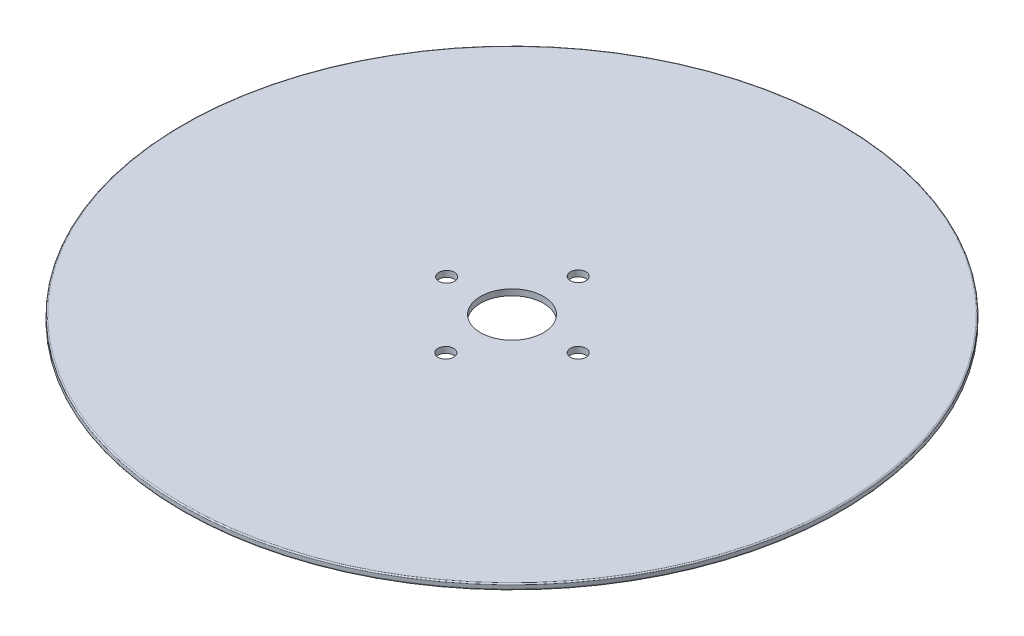
ISO-10303-21;
HEADER;
FILE_DESCRIPTION(('STEP AP214'),'2;1');
FILE_NAME('part.step','',(''),(''),'','','');
FILE_SCHEMA(('AUTOMOTIVE_DESIGN { 1 0 10303 214 1 1 1 1 }'));
ENDSEC;
DATA;
#1=APPLICATION_CONTEXT('core data for automotive mechanical design processes');
#2=APPLICATION_PROTOCOL_DEFINITION('international standard','automotive_design',2000,#1);
#3=PRODUCT_CONTEXT('',#1,'mechanical');
#4=PRODUCT('Part','Part','',(#3));
#5=PRODUCT_RELATED_PRODUCT_CATEGORY('part','',(#4));
#6=PRODUCT_DEFINITION_FORMATION('','',#4);
#7=PRODUCT_DEFINITION_CONTEXT('part definition',#1,'design');
#8=PRODUCT_DEFINITION('design','',#6,#7);
#9=PRODUCT_DEFINITION_SHAPE('','',#8);
#10=(LENGTH_UNIT() NAMED_UNIT(*) SI_UNIT(.MILLI.,.METRE.));
#11=(NAMED_UNIT(*) PLANE_ANGLE_UNIT() SI_UNIT($,.RADIAN.));
#12=(NAMED_UNIT(*) SI_UNIT($,.STERADIAN.) SOLID_ANGLE_UNIT());
#13=UNCERTAINTY_MEASURE_WITH_UNIT(LENGTH_MEASURE(1.E-05),#10,'distance_accuracy_value','');
#14=(GEOMETRIC_REPRESENTATION_CONTEXT(3) GLOBAL_UNCERTAINTY_ASSIGNED_CONTEXT((#13)) GLOBAL_UNIT_ASSIGNED_CONTEXT((#10,
#11,#12)) REPRESENTATION_CONTEXT('',''));
#15=CARTESIAN_POINT('',(0.,0.,0.));
#16=DIRECTION('',(0.,0.,1.));
#17=DIRECTION('',(1.,0.,0.));
#18=AXIS2_PLACEMENT_3D('',#15,#16,#17);
#19=CARTESIAN_POINT('',(0.,1.,0.));
#20=DIRECTION('',(0.,-1.,0.));
#21=DIRECTION('',(0.,0.,-1.));
#22=AXIS2_PLACEMENT_3D('',#19,#20,#21);
#23=CYLINDRICAL_SURFACE('',#22,55.);
#24=CARTESIAN_POINT('',(0.,0.8,0.));
#25=DIRECTION('',(0.,1.,0.));
#26=DIRECTION('',(0.,0.,1.));
#27=AXIS2_PLACEMENT_3D('',#24,#25,#26);
#28=CIRCLE('',#27,55.);
#29=CARTESIAN_POINT('',(0.,0.8,55.));
#30=VERTEX_POINT('',#29);
#31=EDGE_CURVE('E44',#30,#30,#28,.F.);
#32=ORIENTED_EDGE('',*,*,#31,.T.);
#33=EDGE_LOOP('',(#32));
#34=FACE_BOUND('',#33,.T.);
#35=CARTESIAN_POINT('',(0.,0.2,0.));
#36=DIRECTION('',(0.,1.,0.));
#37=DIRECTION('',(0.,0.,1.));
#38=AXIS2_PLACEMENT_3D('',#35,#36,#37);
#39=CIRCLE('',#38,55.);
#40=CARTESIAN_POINT('',(0.,0.2,55.));
#41=VERTEX_POINT('',#40);
#42=EDGE_CURVE('E49',#41,#41,#39,.T.);
#43=ORIENTED_EDGE('',*,*,#42,.T.);
#44=EDGE_LOOP('',(#43));
#45=FACE_BOUND('',#44,.T.);
#46=ADVANCED_FACE('F36',(#34,#45),#23,.T.);
#47=CARTESIAN_POINT('',(0.,1.,0.));
#48=DIRECTION('',(0.,1.,0.));
#49=DIRECTION('',(0.,0.,1.));
#50=AXIS2_PLACEMENT_3D('',#47,#48,#49);
#51=PLANE('',#50);
#52=CARTESIAN_POINT('',(-10.9009167309934,1.,0.));
#53=DIRECTION('',(0.,1.,0.));
#54=DIRECTION('',(0.,0.,1.));
#55=AXIS2_PLACEMENT_3D('',#52,#53,#54);
#56=CIRCLE('',#55,1.3);
#57=CARTESIAN_POINT('',(-10.9009167309934,1.,1.3));
#58=VERTEX_POINT('',#57);
#59=EDGE_CURVE('E90',#58,#58,#56,.T.);
#60=ORIENTED_EDGE('',*,*,#59,.F.);
#61=EDGE_LOOP('',(#60));
#62=FACE_BOUND('',#61,.T.);
#63=CARTESIAN_POINT('',(0.,1.,-11.05));
#64=DIRECTION('',(0.,1.,0.));
#65=DIRECTION('',(0.,0.,1.));
#66=AXIS2_PLACEMENT_3D('',#63,#64,#65);
#67=CIRCLE('',#66,1.3);
#68=CARTESIAN_POINT('',(0.,1.,-9.75));
#69=VERTEX_POINT('',#68);
#70=EDGE_CURVE('E82',#69,#69,#67,.T.);
#71=ORIENTED_EDGE('',*,*,#70,.F.);
#72=EDGE_LOOP('',(#71));
#73=FACE_BOUND('',#72,.T.);
#74=CARTESIAN_POINT('',(11.05,1.,0.));
#75=DIRECTION('',(0.,1.,0.));
#76=DIRECTION('',(0.,0.,1.));
#77=AXIS2_PLACEMENT_3D('',#74,#75,#76);
#78=CIRCLE('',#77,1.3);
#79=CARTESIAN_POINT('',(11.05,1.,1.3));
#80=VERTEX_POINT('',#79);
#81=EDGE_CURVE('E73',#80,#80,#78,.T.);
#82=ORIENTED_EDGE('',*,*,#81,.F.);
#83=EDGE_LOOP('',(#82));
#84=FACE_BOUND('',#83,.T.);
#85=CARTESIAN_POINT('',(0.,1.,11.05));
#86=DIRECTION('',(0.,1.,0.));
#87=DIRECTION('',(0.,0.,1.));
#88=AXIS2_PLACEMENT_3D('',#85,#86,#87);
#89=CIRCLE('',#88,1.3);
#90=CARTESIAN_POINT('',(0.,1.,12.35));
#91=VERTEX_POINT('',#90);
#92=EDGE_CURVE('E74',#91,#91,#89,.T.);
#93=ORIENTED_EDGE('',*,*,#92,.F.);
#94=EDGE_LOOP('',(#93));
#95=FACE_BOUND('',#94,.T.);
#96=CARTESIAN_POINT('',(0.,1.,0.));
#97=DIRECTION('',(0.,1.,0.));
#98=DIRECTION('',(0.,0.,1.));
#99=AXIS2_PLACEMENT_3D('',#96,#97,#98);
#100=CIRCLE('',#99,5.25);
#101=CARTESIAN_POINT('',(0.,1.,5.25));
#102=VERTEX_POINT('',#101);
#103=EDGE_CURVE('E61',#102,#102,#100,.T.);
#104=ORIENTED_EDGE('',*,*,#103,.F.);
#105=EDGE_LOOP('',(#104));
#106=FACE_BOUND('',#105,.T.);
#107=CARTESIAN_POINT('',(0.,1.,0.));
#108=DIRECTION('',(0.,1.,0.));
#109=DIRECTION('',(0.,0.,1.));
#110=AXIS2_PLACEMENT_3D('',#107,#108,#109);
#111=CIRCLE('',#110,54.8);
#112=CARTESIAN_POINT('',(0.,1.,54.8));
#113=VERTEX_POINT('',#112);
#114=EDGE_CURVE('E54',#113,#113,#111,.T.);
#115=ORIENTED_EDGE('',*,*,#114,.T.);
#116=EDGE_LOOP('',(#115));
#117=FACE_BOUND('',#116,.T.);
#118=ADVANCED_FACE('F103',(#62,#73,#84,#95,#106,#117),#51,.T.);
#119=CARTESIAN_POINT('',(0.,0.,0.));
#120=DIRECTION('',(0.,1.,0.));
#121=DIRECTION('',(0.,0.,1.));
#122=AXIS2_PLACEMENT_3D('',#119,#120,#121);
#123=PLANE('',#122);
#124=CARTESIAN_POINT('',(-10.9009167309934,0.,0.));
#125=DIRECTION('',(0.,1.,0.));
#126=DIRECTION('',(0.,0.,1.));
#127=AXIS2_PLACEMENT_3D('',#124,#125,#126);
#128=CIRCLE('',#127,1.3);
#129=CARTESIAN_POINT('',(-10.9009167309934,0.,1.3));
#130=VERTEX_POINT('',#129);
#131=EDGE_CURVE('E65',#130,#130,#128,.F.);
#132=ORIENTED_EDGE('',*,*,#131,.F.);
#133=EDGE_LOOP('',(#132));
#134=FACE_BOUND('',#133,.T.);
#135=CARTESIAN_POINT('',(0.,0.,-11.05));
#136=DIRECTION('',(0.,1.,0.));
#137=DIRECTION('',(0.,0.,1.));
#138=AXIS2_PLACEMENT_3D('',#135,#136,#137);
#139=CIRCLE('',#138,1.3);
#140=CARTESIAN_POINT('',(0.,0.,-9.75));
#141=VERTEX_POINT('',#140);
#142=EDGE_CURVE('E86',#141,#141,#139,.F.);
#143=ORIENTED_EDGE('',*,*,#142,.F.);
#144=EDGE_LOOP('',(#143));
#145=FACE_BOUND('',#144,.T.);
#146=CARTESIAN_POINT('',(11.05,0.,0.));
#147=DIRECTION('',(0.,1.,0.));
#148=DIRECTION('',(0.,0.,1.));
#149=AXIS2_PLACEMENT_3D('',#146,#147,#148);
#150=CIRCLE('',#149,1.3);
#151=CARTESIAN_POINT('',(11.05,0.,1.3));
#152=VERTEX_POINT('',#151);
#153=EDGE_CURVE('E78',#152,#152,#150,.F.);
#154=ORIENTED_EDGE('',*,*,#153,.F.);
#155=EDGE_LOOP('',(#154));
#156=FACE_BOUND('',#155,.T.);
#157=CARTESIAN_POINT('',(0.,0.,11.05));
#158=DIRECTION('',(0.,1.,0.));
#159=DIRECTION('',(0.,0.,1.));
#160=AXIS2_PLACEMENT_3D('',#157,#158,#159);
#161=CIRCLE('',#160,1.3);
#162=CARTESIAN_POINT('',(0.,0.,12.35));
#163=VERTEX_POINT('',#162);
#164=EDGE_CURVE('E69',#163,#163,#161,.F.);
#165=ORIENTED_EDGE('',*,*,#164,.F.);
#166=EDGE_LOOP('',(#165));
#167=FACE_BOUND('',#166,.T.);
#168=CARTESIAN_POINT('',(0.,0.,0.));
#169=DIRECTION('',(0.,1.,0.));
#170=DIRECTION('',(0.,0.,1.));
#171=AXIS2_PLACEMENT_3D('',#168,#169,#170);
#172=CIRCLE('',#171,5.25);
#173=CARTESIAN_POINT('',(0.,0.,5.25));
#174=VERTEX_POINT('',#173);
#175=EDGE_CURVE('E60',#174,#174,#172,.T.);
#176=ORIENTED_EDGE('',*,*,#175,.T.);
#177=EDGE_LOOP('',(#176));
#178=FACE_BOUND('',#177,.T.);
#179=CARTESIAN_POINT('',(0.,0.,0.));
#180=DIRECTION('',(0.,1.,0.));
#181=DIRECTION('',(0.,0.,1.));
#182=AXIS2_PLACEMENT_3D('',#179,#180,#181);
#183=CIRCLE('',#182,54.8);
#184=CARTESIAN_POINT('',(0.,0.,54.8));
#185=VERTEX_POINT('',#184);
#186=EDGE_CURVE('E10',#185,#185,#183,.F.);
#187=ORIENTED_EDGE('',*,*,#186,.T.);
#188=EDGE_LOOP('',(#187));
#189=FACE_BOUND('',#188,.T.);
#190=ADVANCED_FACE('F106',(#134,#145,#156,#167,#178,#189),#123,.F.);
#191=CARTESIAN_POINT('',(0.,0.8,0.));
#192=DIRECTION('',(0.,1.,0.));
#193=DIRECTION('',(0.,0.,1.));
#194=AXIS2_PLACEMENT_3D('',#191,#192,#193);
#195=TOROIDAL_SURFACE('',#194,54.8,0.2);
#196=ORIENTED_EDGE('',*,*,#31,.F.);
#197=EDGE_LOOP('',(#196));
#198=FACE_BOUND('',#197,.T.);
#199=ORIENTED_EDGE('',*,*,#114,.F.);
#200=EDGE_LOOP('',(#199));
#201=FACE_BOUND('',#200,.T.);
#202=ADVANCED_FACE('F118',(#198,#201),#195,.T.);
#203=CARTESIAN_POINT('',(0.,0.2,0.));
#204=DIRECTION('',(0.,1.,0.));
#205=DIRECTION('',(0.,0.,1.));
#206=AXIS2_PLACEMENT_3D('',#203,#204,#205);
#207=TOROIDAL_SURFACE('',#206,54.8,0.2);
#208=ORIENTED_EDGE('',*,*,#186,.F.);
#209=EDGE_LOOP('',(#208));
#210=FACE_BOUND('',#209,.T.);
#211=ORIENTED_EDGE('',*,*,#42,.F.);
#212=EDGE_LOOP('',(#211));
#213=FACE_BOUND('',#212,.T.);
#214=ADVANCED_FACE('F38',(#210,#213),#207,.T.);
#215=CARTESIAN_POINT('',(0.,0.,0.));
#216=DIRECTION('',(0.,1.,0.));
#217=DIRECTION('',(0.,0.,1.));
#218=AXIS2_PLACEMENT_3D('',#215,#216,#217);
#219=CYLINDRICAL_SURFACE('',#218,5.25);
#220=ORIENTED_EDGE('',*,*,#175,.F.);
#221=EDGE_LOOP('',(#220));
#222=FACE_BOUND('',#221,.T.);
#223=ORIENTED_EDGE('',*,*,#103,.T.);
#224=EDGE_LOOP('',(#223));
#225=FACE_BOUND('',#224,.T.);
#226=ADVANCED_FACE('F125',(#222,#225),#219,.F.);
#227=CARTESIAN_POINT('',(0.,-3.67695526217005,11.05));
#228=DIRECTION('',(0.,1.,0.));
#229=DIRECTION('',(0.,0.,1.));
#230=AXIS2_PLACEMENT_3D('',#227,#228,#229);
#231=CYLINDRICAL_SURFACE('',#230,1.3);
#232=ORIENTED_EDGE('',*,*,#164,.T.);
#233=EDGE_LOOP('',(#232));
#234=FACE_BOUND('',#233,.T.);
#235=ORIENTED_EDGE('',*,*,#92,.T.);
#236=EDGE_LOOP('',(#235));
#237=FACE_BOUND('',#236,.T.);
#238=ADVANCED_FACE('F139',(#234,#237),#231,.F.);
#239=CARTESIAN_POINT('',(11.05,-3.67695526217005,0.));
#240=DIRECTION('',(0.,1.,0.));
#241=DIRECTION('',(0.,0.,1.));
#242=AXIS2_PLACEMENT_3D('',#239,#240,#241);
#243=CYLINDRICAL_SURFACE('',#242,1.3);
#244=ORIENTED_EDGE('',*,*,#153,.T.);
#245=EDGE_LOOP('',(#244));
#246=FACE_BOUND('',#245,.T.);
#247=ORIENTED_EDGE('',*,*,#81,.T.);
#248=EDGE_LOOP('',(#247));
#249=FACE_BOUND('',#248,.T.);
#250=ADVANCED_FACE('F143',(#246,#249),#243,.F.);
#251=CARTESIAN_POINT('',(0.,-3.67695526217005,-11.05));
#252=DIRECTION('',(0.,1.,0.));
#253=DIRECTION('',(0.,0.,1.));
#254=AXIS2_PLACEMENT_3D('',#251,#252,#253);
#255=CYLINDRICAL_SURFACE('',#254,1.3);
#256=ORIENTED_EDGE('',*,*,#142,.T.);
#257=EDGE_LOOP('',(#256));
#258=FACE_BOUND('',#257,.T.);
#259=ORIENTED_EDGE('',*,*,#70,.T.);
#260=EDGE_LOOP('',(#259));
#261=FACE_BOUND('',#260,.T.);
#262=ADVANCED_FACE('F147',(#258,#261),#255,.F.);
#263=CARTESIAN_POINT('',(-10.9009167309934,-3.67695526217005,0.));
#264=DIRECTION('',(0.,1.,0.));
#265=DIRECTION('',(0.,0.,1.));
#266=AXIS2_PLACEMENT_3D('',#263,#264,#265);
#267=CYLINDRICAL_SURFACE('',#266,1.3);
#268=ORIENTED_EDGE('',*,*,#131,.T.);
#269=EDGE_LOOP('',(#268));
#270=FACE_BOUND('',#269,.T.);
#271=ORIENTED_EDGE('',*,*,#59,.T.);
#272=EDGE_LOOP('',(#271));
#273=FACE_BOUND('',#272,.T.);
#274=ADVANCED_FACE('F101',(#270,#273),#267,.F.);
#275=CLOSED_SHELL('',(#46,#118,#190,#202,#214,#226,#238,#250,#262,#274));
#276=MANIFOLD_SOLID_BREP('B2',#275);
#277=ADVANCED_BREP_SHAPE_REPRESENTATION('',(#18,#276),#14);
#278=SHAPE_DEFINITION_REPRESENTATION(#9,#277);
ENDSEC;
END-ISO-10303-21;
